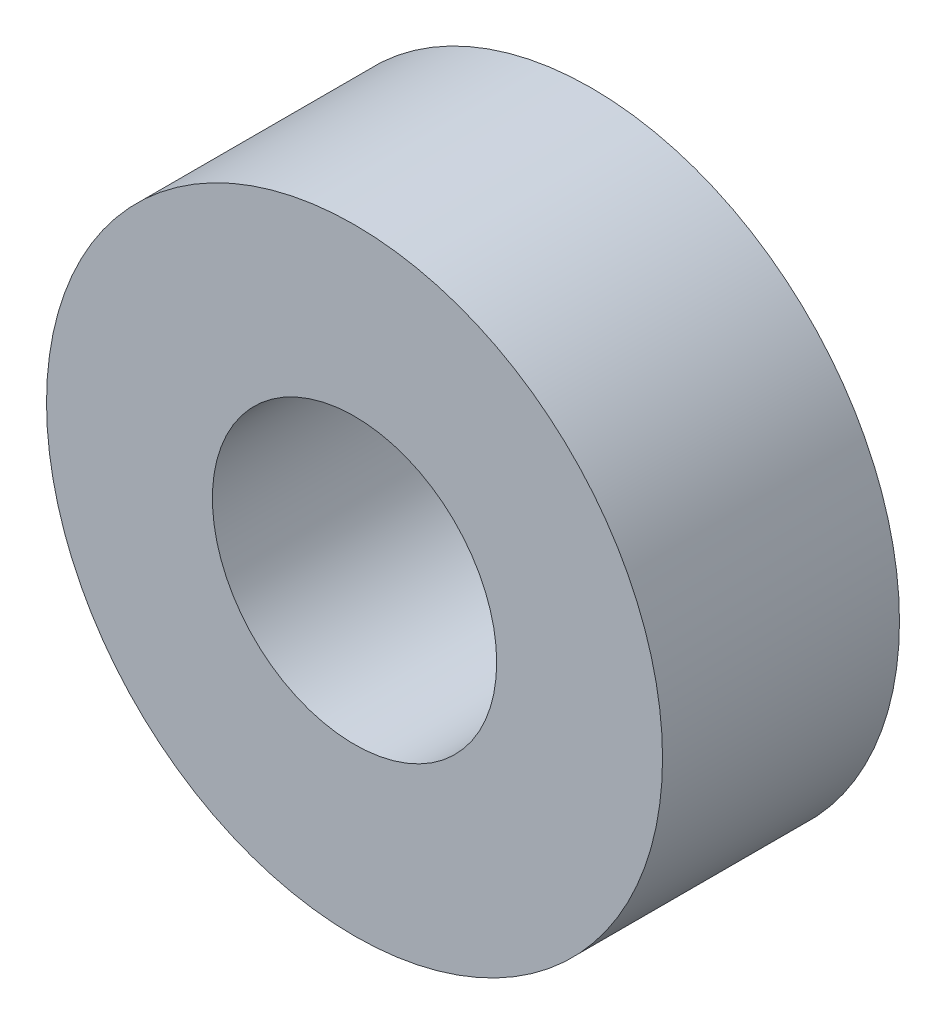
ISO-10303-21;
HEADER;
FILE_DESCRIPTION(('STEP AP214'),'2;1');
FILE_NAME('part.step','',(''),(''),'','','');
FILE_SCHEMA(('AUTOMOTIVE_DESIGN { 1 0 10303 214 1 1 1 1 }'));
ENDSEC;
DATA;
#1=APPLICATION_CONTEXT('core data for automotive mechanical design processes');
#2=APPLICATION_PROTOCOL_DEFINITION('international standard','automotive_design',2000,#1);
#3=PRODUCT_CONTEXT('',#1,'mechanical');
#4=PRODUCT('Part','Part','',(#3));
#5=PRODUCT_RELATED_PRODUCT_CATEGORY('part','',(#4));
#6=PRODUCT_DEFINITION_FORMATION('','',#4);
#7=PRODUCT_DEFINITION_CONTEXT('part definition',#1,'design');
#8=PRODUCT_DEFINITION('design','',#6,#7);
#9=PRODUCT_DEFINITION_SHAPE('','',#8);
#10=(LENGTH_UNIT() NAMED_UNIT(*) SI_UNIT(.MILLI.,.METRE.));
#11=(NAMED_UNIT(*) PLANE_ANGLE_UNIT() SI_UNIT($,.RADIAN.));
#12=(NAMED_UNIT(*) SI_UNIT($,.STERADIAN.) SOLID_ANGLE_UNIT());
#13=UNCERTAINTY_MEASURE_WITH_UNIT(LENGTH_MEASURE(1.E-05),#10,'distance_accuracy_value','');
#14=(GEOMETRIC_REPRESENTATION_CONTEXT(3) GLOBAL_UNCERTAINTY_ASSIGNED_CONTEXT((#13)) GLOBAL_UNIT_ASSIGNED_CONTEXT((#10,
#11,#12)) REPRESENTATION_CONTEXT('',''));
#15=CARTESIAN_POINT('',(0.,0.,0.));
#16=DIRECTION('',(0.,0.,1.));
#17=DIRECTION('',(1.,0.,0.));
#18=AXIS2_PLACEMENT_3D('',#15,#16,#17);
#19=CARTESIAN_POINT('',(0.,0.,5.));
#20=DIRECTION('',(0.,0.,-1.));
#21=DIRECTION('',(-1.,0.,0.));
#22=AXIS2_PLACEMENT_3D('',#19,#20,#21);
#23=CYLINDRICAL_SURFACE('',#22,6.5);
#24=CARTESIAN_POINT('',(0.,0.,5.));
#25=DIRECTION('',(0.,0.,1.));
#26=DIRECTION('',(1.,0.,0.));
#27=AXIS2_PLACEMENT_3D('',#24,#25,#26);
#28=CIRCLE('',#27,6.5);
#29=CARTESIAN_POINT('',(6.5,0.,5.));
#30=VERTEX_POINT('',#29);
#31=EDGE_CURVE('E10',#30,#30,#28,.T.);
#32=ORIENTED_EDGE('',*,*,#31,.F.);
#33=EDGE_LOOP('',(#32));
#34=FACE_BOUND('',#33,.T.);
#35=CARTESIAN_POINT('',(0.,0.,0.));
#36=DIRECTION('',(0.,0.,1.));
#37=DIRECTION('',(1.,0.,0.));
#38=AXIS2_PLACEMENT_3D('',#35,#36,#37);
#39=CIRCLE('',#38,6.5);
#40=CARTESIAN_POINT('',(6.5,0.,0.));
#41=VERTEX_POINT('',#40);
#42=EDGE_CURVE('E42',#41,#41,#39,.T.);
#43=ORIENTED_EDGE('',*,*,#42,.T.);
#44=EDGE_LOOP('',(#43));
#45=FACE_BOUND('',#44,.T.);
#46=ADVANCED_FACE('F41',(#34,#45),#23,.T.);
#47=CARTESIAN_POINT('',(0.,0.,5.));
#48=DIRECTION('',(0.,0.,1.));
#49=DIRECTION('',(1.,0.,0.));
#50=AXIS2_PLACEMENT_3D('',#47,#48,#49);
#51=PLANE('',#50);
#52=CARTESIAN_POINT('',(0.,0.,5.));
#53=DIRECTION('',(0.,0.,1.));
#54=DIRECTION('',(1.,0.,0.));
#55=AXIS2_PLACEMENT_3D('',#52,#53,#54);
#56=CIRCLE('',#55,3.);
#57=CARTESIAN_POINT('',(3.,0.,5.));
#58=VERTEX_POINT('',#57);
#59=EDGE_CURVE('E52',#58,#58,#56,.T.);
#60=ORIENTED_EDGE('',*,*,#59,.F.);
#61=EDGE_LOOP('',(#60));
#62=FACE_BOUND('',#61,.T.);
#63=ORIENTED_EDGE('',*,*,#31,.T.);
#64=EDGE_LOOP('',(#63));
#65=FACE_BOUND('',#64,.T.);
#66=ADVANCED_FACE('F66',(#62,#65),#51,.T.);
#67=CARTESIAN_POINT('',(0.,0.,0.));
#68=DIRECTION('',(0.,0.,1.));
#69=DIRECTION('',(1.,0.,0.));
#70=AXIS2_PLACEMENT_3D('',#67,#68,#69);
#71=PLANE('',#70);
#72=CARTESIAN_POINT('',(0.,0.,0.));
#73=DIRECTION('',(0.,0.,1.));
#74=DIRECTION('',(1.,0.,0.));
#75=AXIS2_PLACEMENT_3D('',#72,#73,#74);
#76=CIRCLE('',#75,3.);
#77=CARTESIAN_POINT('',(3.,0.,0.));
#78=VERTEX_POINT('',#77);
#79=EDGE_CURVE('E51',#78,#78,#76,.T.);
#80=ORIENTED_EDGE('',*,*,#79,.T.);
#81=EDGE_LOOP('',(#80));
#82=FACE_BOUND('',#81,.T.);
#83=ORIENTED_EDGE('',*,*,#42,.F.);
#84=EDGE_LOOP('',(#83));
#85=FACE_BOUND('',#84,.T.);
#86=ADVANCED_FACE('F56',(#82,#85),#71,.F.);
#87=CARTESIAN_POINT('',(0.,0.,0.));
#88=DIRECTION('',(0.,0.,1.));
#89=DIRECTION('',(1.,0.,0.));
#90=AXIS2_PLACEMENT_3D('',#87,#88,#89);
#91=CYLINDRICAL_SURFACE('',#90,3.);
#92=ORIENTED_EDGE('',*,*,#79,.F.);
#93=EDGE_LOOP('',(#92));
#94=FACE_BOUND('',#93,.T.);
#95=ORIENTED_EDGE('',*,*,#59,.T.);
#96=EDGE_LOOP('',(#95));
#97=FACE_BOUND('',#96,.T.);
#98=ADVANCED_FACE('F65',(#94,#97),#91,.F.);
#99=CLOSED_SHELL('',(#46,#66,#86,#98));
#100=MANIFOLD_SOLID_BREP('B2',#99);
#101=ADVANCED_BREP_SHAPE_REPRESENTATION('',(#18,#100),#14);
#102=SHAPE_DEFINITION_REPRESENTATION(#9,#101);
ENDSEC;
END-ISO-10303-21;
